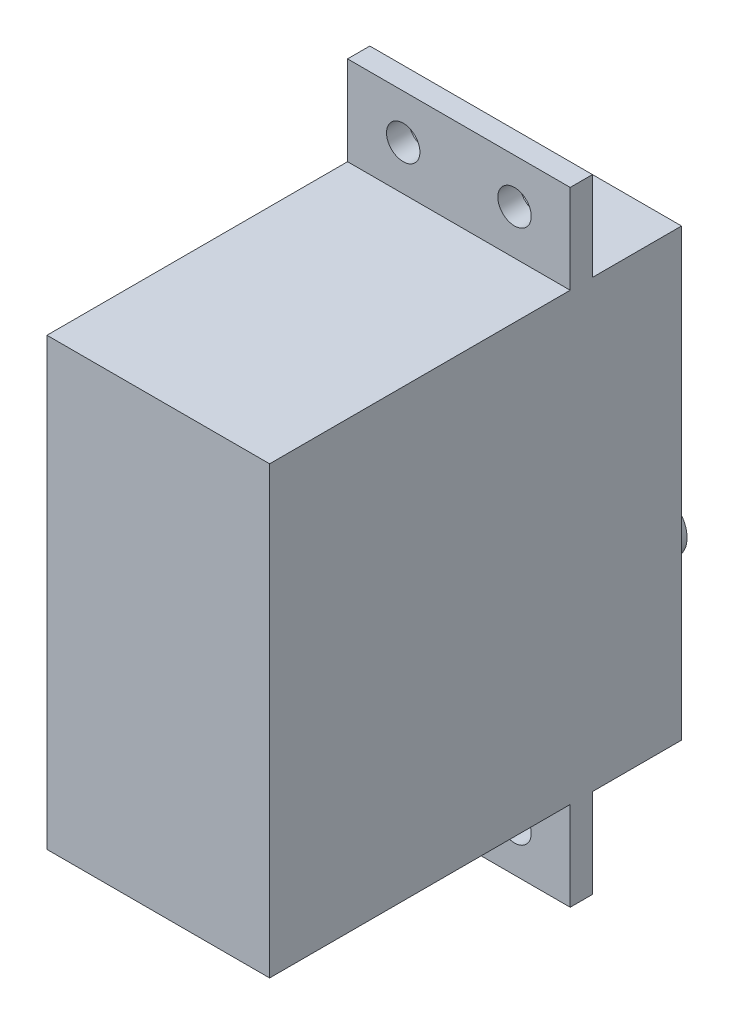
ISO-10303-21;
HEADER;
FILE_DESCRIPTION(('STEP AP214'),'2;1');
FILE_NAME('part.step','',(''),(''),'','','');
FILE_SCHEMA(('AUTOMOTIVE_DESIGN { 1 0 10303 214 1 1 1 1 }'));
ENDSEC;
DATA;
#1=APPLICATION_CONTEXT('core data for automotive mechanical design processes');
#2=APPLICATION_PROTOCOL_DEFINITION('international standard','automotive_design',2000,#1);
#3=PRODUCT_CONTEXT('',#1,'mechanical');
#4=PRODUCT('Part','Part','',(#3));
#5=PRODUCT_RELATED_PRODUCT_CATEGORY('part','',(#4));
#6=PRODUCT_DEFINITION_FORMATION('','',#4);
#7=PRODUCT_DEFINITION_CONTEXT('part definition',#1,'design');
#8=PRODUCT_DEFINITION('design','',#6,#7);
#9=PRODUCT_DEFINITION_SHAPE('','',#8);
#10=(LENGTH_UNIT() NAMED_UNIT(*) SI_UNIT(.MILLI.,.METRE.));
#11=(NAMED_UNIT(*) PLANE_ANGLE_UNIT() SI_UNIT($,.RADIAN.));
#12=(NAMED_UNIT(*) SI_UNIT($,.STERADIAN.) SOLID_ANGLE_UNIT());
#13=UNCERTAINTY_MEASURE_WITH_UNIT(LENGTH_MEASURE(1.E-05),#10,'distance_accuracy_value','');
#14=(GEOMETRIC_REPRESENTATION_CONTEXT(3) GLOBAL_UNCERTAINTY_ASSIGNED_CONTEXT((#13)) GLOBAL_UNIT_ASSIGNED_CONTEXT((#10,
#11,#12)) REPRESENTATION_CONTEXT('',''));
#15=CARTESIAN_POINT('',(0.,0.,0.));
#16=DIRECTION('',(0.,0.,1.));
#17=DIRECTION('',(1.,0.,0.));
#18=AXIS2_PLACEMENT_3D('',#15,#16,#17);
#19=CARTESIAN_POINT('',(-10.,-20.,37.));
#20=DIRECTION('',(0.,1.,0.));
#21=DIRECTION('',(0.,0.,1.));
#22=AXIS2_PLACEMENT_3D('',#19,#20,#21);
#23=PLANE('',#22);
#24=DIRECTION('',(0.,0.,-1.));
#25=VECTOR('',#24,1.);
#26=CARTESIAN_POINT('',(-10.,-20.,37.));
#27=LINE('',#26,#25);
#28=CARTESIAN_POINT('',(-10.,-20.,37.));
#29=VERTEX_POINT('',#28);
#30=CARTESIAN_POINT('',(-10.,-20.,10.));
#31=VERTEX_POINT('',#30);
#32=EDGE_CURVE('E254',#29,#31,#27,.T.);
#33=ORIENTED_EDGE('',*,*,#32,.T.);
#34=DIRECTION('',(1.,0.,0.));
#35=VECTOR('',#34,1.);
#36=CARTESIAN_POINT('',(-10.,-20.,10.));
#37=LINE('',#36,#35);
#38=CARTESIAN_POINT('',(10.,-20.,10.));
#39=VERTEX_POINT('',#38);
#40=EDGE_CURVE('E150',#31,#39,#37,.T.);
#41=ORIENTED_EDGE('',*,*,#40,.T.);
#42=DIRECTION('',(0.,0.,-1.));
#43=VECTOR('',#42,1.);
#44=CARTESIAN_POINT('',(10.,-20.,37.));
#45=LINE('',#44,#43);
#46=CARTESIAN_POINT('',(10.,-20.,37.));
#47=VERTEX_POINT('',#46);
#48=EDGE_CURVE('E250',#47,#39,#45,.T.);
#49=ORIENTED_EDGE('',*,*,#48,.F.);
#50=DIRECTION('',(1.,0.,0.));
#51=VECTOR('',#50,1.);
#52=CARTESIAN_POINT('',(-10.,-20.,37.));
#53=LINE('',#52,#51);
#54=EDGE_CURVE('E233',#29,#47,#53,.T.);
#55=ORIENTED_EDGE('',*,*,#54,.F.);
#56=EDGE_LOOP('',(#33,#41,#49,#55));
#57=FACE_BOUND('',#56,.T.);
#58=ADVANCED_FACE('F39',(#57),#23,.F.);
#59=CARTESIAN_POINT('',(-10.,20.,37.));
#60=DIRECTION('',(0.,-1.,0.));
#61=DIRECTION('',(0.,0.,-1.));
#62=AXIS2_PLACEMENT_3D('',#59,#60,#61);
#63=PLANE('',#62);
#64=DIRECTION('',(-1.,0.,0.));
#65=VECTOR('',#64,1.);
#66=CARTESIAN_POINT('',(-10.,20.,8.));
#67=LINE('',#66,#65);
#68=CARTESIAN_POINT('',(10.,20.,8.));
#69=VERTEX_POINT('',#68);
#70=CARTESIAN_POINT('',(-10.,20.,8.));
#71=VERTEX_POINT('',#70);
#72=EDGE_CURVE('E65',#69,#71,#67,.T.);
#73=ORIENTED_EDGE('',*,*,#72,.F.);
#74=DIRECTION('',(0.,0.,-1.));
#75=VECTOR('',#74,1.);
#76=CARTESIAN_POINT('',(10.,20.,37.));
#77=LINE('',#76,#75);
#78=CARTESIAN_POINT('',(10.,20.,0.));
#79=VERTEX_POINT('',#78);
#80=EDGE_CURVE('E49',#69,#79,#77,.T.);
#81=ORIENTED_EDGE('',*,*,#80,.T.);
#82=DIRECTION('',(-1.,0.,0.));
#83=VECTOR('',#82,1.);
#84=CARTESIAN_POINT('',(-10.,20.,0.));
#85=LINE('',#84,#83);
#86=CARTESIAN_POINT('',(-10.,20.,0.));
#87=VERTEX_POINT('',#86);
#88=EDGE_CURVE('E240',#79,#87,#85,.T.);
#89=ORIENTED_EDGE('',*,*,#88,.T.);
#90=DIRECTION('',(0.,0.,-1.));
#91=VECTOR('',#90,1.);
#92=CARTESIAN_POINT('',(-10.,20.,37.));
#93=LINE('',#92,#91);
#94=EDGE_CURVE('E258',#71,#87,#93,.T.);
#95=ORIENTED_EDGE('',*,*,#94,.F.);
#96=EDGE_LOOP('',(#73,#81,#89,#95));
#97=FACE_BOUND('',#96,.T.);
#98=ADVANCED_FACE('F313',(#97),#63,.F.);
#99=DIRECTION('',(1.,0.,0.));
#100=VECTOR('',#99,1.);
#101=CARTESIAN_POINT('',(-10.,20.,10.));
#102=LINE('',#101,#100);
#103=CARTESIAN_POINT('',(-10.,20.,10.));
#104=VERTEX_POINT('',#103);
#105=CARTESIAN_POINT('',(10.,20.,10.));
#106=VERTEX_POINT('',#105);
#107=EDGE_CURVE('E186',#104,#106,#102,.T.);
#108=ORIENTED_EDGE('',*,*,#107,.F.);
#109=CARTESIAN_POINT('',(-10.,20.,37.));
#110=VERTEX_POINT('',#109);
#111=EDGE_CURVE('E259',#110,#104,#93,.T.);
#112=ORIENTED_EDGE('',*,*,#111,.F.);
#113=DIRECTION('',(-1.,0.,0.));
#114=VECTOR('',#113,1.);
#115=CARTESIAN_POINT('',(-10.,20.,37.));
#116=LINE('',#115,#114);
#117=CARTESIAN_POINT('',(10.,20.,37.));
#118=VERTEX_POINT('',#117);
#119=EDGE_CURVE('E226',#118,#110,#116,.T.);
#120=ORIENTED_EDGE('',*,*,#119,.F.);
#121=EDGE_CURVE('E11',#118,#106,#77,.T.);
#122=ORIENTED_EDGE('',*,*,#121,.T.);
#123=EDGE_LOOP('',(#108,#112,#120,#122));
#124=FACE_BOUND('',#123,.T.);
#125=ADVANCED_FACE('F320',(#124),#63,.F.);
#126=CARTESIAN_POINT('',(10.,-20.,37.));
#127=DIRECTION('',(-1.,0.,0.));
#128=DIRECTION('',(0.,0.,1.));
#129=AXIS2_PLACEMENT_3D('',#126,#127,#128);
#130=PLANE('',#129);
#131=DIRECTION('',(0.,1.,0.));
#132=VECTOR('',#131,1.);
#133=CARTESIAN_POINT('',(10.,-20.,0.));
#134=LINE('',#133,#132);
#135=CARTESIAN_POINT('',(10.,-20.,0.));
#136=VERTEX_POINT('',#135);
#137=EDGE_CURVE('E221',#136,#79,#134,.T.);
#138=ORIENTED_EDGE('',*,*,#137,.T.);
#139=ORIENTED_EDGE('',*,*,#80,.F.);
#140=DIRECTION('',(0.,-1.,0.));
#141=VECTOR('',#140,1.);
#142=CARTESIAN_POINT('',(10.,28.,8.));
#143=LINE('',#142,#141);
#144=CARTESIAN_POINT('',(10.,28.,8.));
#145=VERTEX_POINT('',#144);
#146=EDGE_CURVE('E209',#145,#69,#143,.T.);
#147=ORIENTED_EDGE('',*,*,#146,.F.);
#148=DIRECTION('',(0.,0.,-1.));
#149=VECTOR('',#148,1.);
#150=CARTESIAN_POINT('',(10.,28.,10.));
#151=LINE('',#150,#149);
#152=CARTESIAN_POINT('',(10.,28.,10.));
#153=VERTEX_POINT('',#152);
#154=EDGE_CURVE('E194',#153,#145,#151,.T.);
#155=ORIENTED_EDGE('',*,*,#154,.F.);
#156=DIRECTION('',(0.,-1.,0.));
#157=VECTOR('',#156,1.);
#158=CARTESIAN_POINT('',(10.,28.,10.));
#159=LINE('',#158,#157);
#160=EDGE_CURVE('E213',#153,#106,#159,.T.);
#161=ORIENTED_EDGE('',*,*,#160,.T.);
#162=ORIENTED_EDGE('',*,*,#121,.F.);
#163=DIRECTION('',(0.,1.,0.));
#164=VECTOR('',#163,1.);
#165=CARTESIAN_POINT('',(10.,-20.,37.));
#166=LINE('',#165,#164);
#167=EDGE_CURVE('E222',#47,#118,#166,.T.);
#168=ORIENTED_EDGE('',*,*,#167,.F.);
#169=ORIENTED_EDGE('',*,*,#48,.T.);
#170=DIRECTION('',(0.,1.,0.));
#171=VECTOR('',#170,1.);
#172=CARTESIAN_POINT('',(10.,-28.,10.));
#173=LINE('',#172,#171);
#174=CARTESIAN_POINT('',(10.,-28.,10.));
#175=VERTEX_POINT('',#174);
#176=EDGE_CURVE('E172',#175,#39,#173,.T.);
#177=ORIENTED_EDGE('',*,*,#176,.F.);
#178=DIRECTION('',(0.,0.,-1.));
#179=VECTOR('',#178,1.);
#180=CARTESIAN_POINT('',(10.,-28.,10.));
#181=LINE('',#180,#179);
#182=CARTESIAN_POINT('',(10.,-28.,8.));
#183=VERTEX_POINT('',#182);
#184=EDGE_CURVE('E154',#175,#183,#181,.T.);
#185=ORIENTED_EDGE('',*,*,#184,.T.);
#186=DIRECTION('',(0.,1.,0.));
#187=VECTOR('',#186,1.);
#188=CARTESIAN_POINT('',(10.,-28.,8.));
#189=LINE('',#188,#187);
#190=CARTESIAN_POINT('',(10.,-20.,8.));
#191=VERTEX_POINT('',#190);
#192=EDGE_CURVE('E139',#183,#191,#189,.T.);
#193=ORIENTED_EDGE('',*,*,#192,.T.);
#194=EDGE_CURVE('E236',#191,#136,#45,.T.);
#195=ORIENTED_EDGE('',*,*,#194,.T.);
#196=EDGE_LOOP('',(#138,#139,#147,#155,#161,#162,#168,#169,#177,#185,#193,#195));
#197=FACE_BOUND('',#196,.T.);
#198=ADVANCED_FACE('F41',(#197),#130,.F.);
#199=CARTESIAN_POINT('',(-10.,-20.,37.));
#200=DIRECTION('',(1.,0.,0.));
#201=DIRECTION('',(0.,0.,-1.));
#202=AXIS2_PLACEMENT_3D('',#199,#200,#201);
#203=PLANE('',#202);
#204=DIRECTION('',(0.,-1.,0.));
#205=VECTOR('',#204,1.);
#206=CARTESIAN_POINT('',(-10.,-20.,0.));
#207=LINE('',#206,#205);
#208=CARTESIAN_POINT('',(-10.,-20.,0.));
#209=VERTEX_POINT('',#208);
#210=EDGE_CURVE('E244',#87,#209,#207,.T.);
#211=ORIENTED_EDGE('',*,*,#210,.T.);
#212=CARTESIAN_POINT('',(-10.,-20.,8.));
#213=VERTEX_POINT('',#212);
#214=EDGE_CURVE('E136',#213,#209,#27,.T.);
#215=ORIENTED_EDGE('',*,*,#214,.F.);
#216=DIRECTION('',(0.,1.,0.));
#217=VECTOR('',#216,1.);
#218=CARTESIAN_POINT('',(-10.,-28.,8.));
#219=LINE('',#218,#217);
#220=CARTESIAN_POINT('',(-10.,-28.,8.));
#221=VERTEX_POINT('',#220);
#222=EDGE_CURVE('E57',#221,#213,#219,.T.);
#223=ORIENTED_EDGE('',*,*,#222,.F.);
#224=DIRECTION('',(0.,0.,1.));
#225=VECTOR('',#224,1.);
#226=CARTESIAN_POINT('',(-10.,-28.,10.));
#227=LINE('',#226,#225);
#228=CARTESIAN_POINT('',(-10.,-28.,10.));
#229=VERTEX_POINT('',#228);
#230=EDGE_CURVE('E134',#221,#229,#227,.T.);
#231=ORIENTED_EDGE('',*,*,#230,.T.);
#232=DIRECTION('',(0.,1.,0.));
#233=VECTOR('',#232,1.);
#234=CARTESIAN_POINT('',(-10.,-28.,10.));
#235=LINE('',#234,#233);
#236=EDGE_CURVE('E162',#229,#31,#235,.T.);
#237=ORIENTED_EDGE('',*,*,#236,.T.);
#238=ORIENTED_EDGE('',*,*,#32,.F.);
#239=DIRECTION('',(0.,-1.,0.));
#240=VECTOR('',#239,1.);
#241=CARTESIAN_POINT('',(-10.,-20.,37.));
#242=LINE('',#241,#240);
#243=EDGE_CURVE('E230',#110,#29,#242,.T.);
#244=ORIENTED_EDGE('',*,*,#243,.F.);
#245=ORIENTED_EDGE('',*,*,#111,.T.);
#246=DIRECTION('',(0.,-1.,0.));
#247=VECTOR('',#246,1.);
#248=CARTESIAN_POINT('',(-10.,28.,10.));
#249=LINE('',#248,#247);
#250=CARTESIAN_POINT('',(-10.,28.,10.));
#251=VERTEX_POINT('',#250);
#252=EDGE_CURVE('E217',#251,#104,#249,.T.);
#253=ORIENTED_EDGE('',*,*,#252,.F.);
#254=DIRECTION('',(0.,0.,1.));
#255=VECTOR('',#254,1.);
#256=CARTESIAN_POINT('',(-10.,28.,10.));
#257=LINE('',#256,#255);
#258=CARTESIAN_POINT('',(-10.,28.,8.));
#259=VERTEX_POINT('',#258);
#260=EDGE_CURVE('E187',#259,#251,#257,.T.);
#261=ORIENTED_EDGE('',*,*,#260,.F.);
#262=DIRECTION('',(0.,-1.,0.));
#263=VECTOR('',#262,1.);
#264=CARTESIAN_POINT('',(-10.,28.,8.));
#265=LINE('',#264,#263);
#266=EDGE_CURVE('E200',#259,#71,#265,.T.);
#267=ORIENTED_EDGE('',*,*,#266,.T.);
#268=ORIENTED_EDGE('',*,*,#94,.T.);
#269=EDGE_LOOP('',(#211,#215,#223,#231,#237,#238,#244,#245,#253,#261,#267,#268));
#270=FACE_BOUND('',#269,.T.);
#271=ADVANCED_FACE('F133',(#270),#203,.F.);
#272=ORIENTED_EDGE('',*,*,#194,.F.);
#273=DIRECTION('',(-1.,0.,0.));
#274=VECTOR('',#273,1.);
#275=CARTESIAN_POINT('',(-10.,-20.,8.));
#276=LINE('',#275,#274);
#277=EDGE_CURVE('E163',#191,#213,#276,.T.);
#278=ORIENTED_EDGE('',*,*,#277,.T.);
#279=ORIENTED_EDGE('',*,*,#214,.T.);
#280=DIRECTION('',(1.,0.,0.));
#281=VECTOR('',#280,1.);
#282=CARTESIAN_POINT('',(-10.,-20.,0.));
#283=LINE('',#282,#281);
#284=EDGE_CURVE('E227',#209,#136,#283,.T.);
#285=ORIENTED_EDGE('',*,*,#284,.T.);
#286=EDGE_LOOP('',(#272,#278,#279,#285));
#287=FACE_BOUND('',#286,.T.);
#288=ADVANCED_FACE('F316',(#287),#23,.F.);
#289=CARTESIAN_POINT('',(0.,0.,37.));
#290=DIRECTION('',(0.,0.,-1.));
#291=DIRECTION('',(-1.,0.,0.));
#292=AXIS2_PLACEMENT_3D('',#289,#290,#291);
#293=PLANE('',#292);
#294=ORIENTED_EDGE('',*,*,#167,.T.);
#295=ORIENTED_EDGE('',*,*,#119,.T.);
#296=ORIENTED_EDGE('',*,*,#243,.T.);
#297=ORIENTED_EDGE('',*,*,#54,.T.);
#298=EDGE_LOOP('',(#294,#295,#296,#297));
#299=FACE_BOUND('',#298,.T.);
#300=ADVANCED_FACE('F324',(#299),#293,.F.);
#301=CARTESIAN_POINT('',(0.,0.,0.));
#302=DIRECTION('',(0.,0.,-1.));
#303=DIRECTION('',(-1.,0.,0.));
#304=AXIS2_PLACEMENT_3D('',#301,#302,#303);
#305=PLANE('',#304);
#306=CARTESIAN_POINT('',(0.,-12.,0.));
#307=DIRECTION('',(0.,0.,-1.));
#308=DIRECTION('',(-1.,0.,0.));
#309=AXIS2_PLACEMENT_3D('',#306,#307,#308);
#310=CIRCLE('',#309,2.5);
#311=CARTESIAN_POINT('',(-2.5,-12.,0.));
#312=VERTEX_POINT('',#311);
#313=EDGE_CURVE('E280',#312,#312,#310,.T.);
#314=ORIENTED_EDGE('',*,*,#313,.F.);
#315=EDGE_LOOP('',(#314));
#316=FACE_BOUND('',#315,.T.);
#317=ORIENTED_EDGE('',*,*,#137,.F.);
#318=ORIENTED_EDGE('',*,*,#284,.F.);
#319=ORIENTED_EDGE('',*,*,#210,.F.);
#320=ORIENTED_EDGE('',*,*,#88,.F.);
#321=EDGE_LOOP('',(#317,#318,#319,#320));
#322=FACE_BOUND('',#321,.T.);
#323=ADVANCED_FACE('F330',(#316,#322),#305,.T.);
#324=CARTESIAN_POINT('',(-10.,28.,10.));
#325=DIRECTION('',(0.,0.,-1.));
#326=DIRECTION('',(-1.,0.,0.));
#327=AXIS2_PLACEMENT_3D('',#324,#325,#326);
#328=PLANE('',#327);
#329=CARTESIAN_POINT('',(5.,24.,10.));
#330=DIRECTION('',(0.,0.,-1.));
#331=DIRECTION('',(-1.,0.,0.));
#332=AXIS2_PLACEMENT_3D('',#329,#330,#331);
#333=CIRCLE('',#332,1.5);
#334=CARTESIAN_POINT('',(6.5,24.,10.));
#335=VERTEX_POINT('',#334);
#336=EDGE_CURVE('E182',#335,#335,#333,.T.);
#337=ORIENTED_EDGE('',*,*,#336,.T.);
#338=EDGE_LOOP('',(#337));
#339=FACE_BOUND('',#338,.T.);
#340=CARTESIAN_POINT('',(-5.,24.,10.));
#341=DIRECTION('',(0.,0.,-1.));
#342=DIRECTION('',(-1.,0.,0.));
#343=AXIS2_PLACEMENT_3D('',#340,#341,#342);
#344=CIRCLE('',#343,1.5);
#345=CARTESIAN_POINT('',(-3.5,24.,10.));
#346=VERTEX_POINT('',#345);
#347=EDGE_CURVE('E177',#346,#346,#344,.T.);
#348=ORIENTED_EDGE('',*,*,#347,.T.);
#349=EDGE_LOOP('',(#348));
#350=FACE_BOUND('',#349,.T.);
#351=ORIENTED_EDGE('',*,*,#107,.T.);
#352=ORIENTED_EDGE('',*,*,#160,.F.);
#353=DIRECTION('',(1.,0.,0.));
#354=VECTOR('',#353,1.);
#355=CARTESIAN_POINT('',(-10.,28.,10.));
#356=LINE('',#355,#354);
#357=EDGE_CURVE('E191',#251,#153,#356,.T.);
#358=ORIENTED_EDGE('',*,*,#357,.F.);
#359=ORIENTED_EDGE('',*,*,#252,.T.);
#360=EDGE_LOOP('',(#351,#352,#358,#359));
#361=FACE_BOUND('',#360,.T.);
#362=ADVANCED_FACE('F360',(#339,#350,#361),#328,.F.);
#363=CARTESIAN_POINT('',(-10.,28.,8.));
#364=DIRECTION('',(0.,0.,1.));
#365=DIRECTION('',(1.,0.,0.));
#366=AXIS2_PLACEMENT_3D('',#363,#364,#365);
#367=PLANE('',#366);
#368=CARTESIAN_POINT('',(5.,24.,8.));
#369=DIRECTION('',(0.,0.,1.));
#370=DIRECTION('',(1.,0.,0.));
#371=AXIS2_PLACEMENT_3D('',#368,#369,#370);
#372=CIRCLE('',#371,1.5);
#373=CARTESIAN_POINT('',(6.5,24.,8.));
#374=VERTEX_POINT('',#373);
#375=EDGE_CURVE('E181',#374,#374,#372,.T.);
#376=ORIENTED_EDGE('',*,*,#375,.T.);
#377=EDGE_LOOP('',(#376));
#378=FACE_BOUND('',#377,.T.);
#379=CARTESIAN_POINT('',(-5.,24.,8.));
#380=DIRECTION('',(0.,0.,1.));
#381=DIRECTION('',(1.,0.,0.));
#382=AXIS2_PLACEMENT_3D('',#379,#380,#381);
#383=CIRCLE('',#382,1.5);
#384=CARTESIAN_POINT('',(-3.5,24.,8.));
#385=VERTEX_POINT('',#384);
#386=EDGE_CURVE('E138',#385,#385,#383,.T.);
#387=ORIENTED_EDGE('',*,*,#386,.T.);
#388=EDGE_LOOP('',(#387));
#389=FACE_BOUND('',#388,.T.);
#390=ORIENTED_EDGE('',*,*,#72,.T.);
#391=ORIENTED_EDGE('',*,*,#266,.F.);
#392=DIRECTION('',(-1.,0.,0.));
#393=VECTOR('',#392,1.);
#394=CARTESIAN_POINT('',(-10.,28.,8.));
#395=LINE('',#394,#393);
#396=EDGE_CURVE('E197',#145,#259,#395,.T.);
#397=ORIENTED_EDGE('',*,*,#396,.F.);
#398=ORIENTED_EDGE('',*,*,#146,.T.);
#399=EDGE_LOOP('',(#390,#391,#397,#398));
#400=FACE_BOUND('',#399,.T.);
#401=ADVANCED_FACE('F367',(#378,#389,#400),#367,.F.);
#402=CARTESIAN_POINT('',(0.,28.,0.));
#403=DIRECTION('',(0.,-1.,0.));
#404=DIRECTION('',(0.,0.,-1.));
#405=AXIS2_PLACEMENT_3D('',#402,#403,#404);
#406=PLANE('',#405);
#407=ORIENTED_EDGE('',*,*,#260,.T.);
#408=ORIENTED_EDGE('',*,*,#357,.T.);
#409=ORIENTED_EDGE('',*,*,#154,.T.);
#410=ORIENTED_EDGE('',*,*,#396,.T.);
#411=EDGE_LOOP('',(#407,#408,#409,#410));
#412=FACE_BOUND('',#411,.T.);
#413=ADVANCED_FACE('F363',(#412),#406,.F.);
#414=CARTESIAN_POINT('',(-5.,24.,-1.2E-05));
#415=DIRECTION('',(0.,0.,1.));
#416=DIRECTION('',(1.,0.,0.));
#417=AXIS2_PLACEMENT_3D('',#414,#415,#416);
#418=CYLINDRICAL_SURFACE('',#417,1.5);
#419=CARTESIAN_POINT('',(-3.5,24.,8.));
#420=CARTESIAN_POINT('',(-3.5,24.,8.02083333333333));
#421=CARTESIAN_POINT('',(-3.5,24.,8.04166666666667));
#422=CARTESIAN_POINT('',(-3.5,24.,8.08333333333333));
#423=CARTESIAN_POINT('',(-3.5,24.,8.10416666666667));
#424=CARTESIAN_POINT('',(-3.5,24.,8.14583333333333));
#425=CARTESIAN_POINT('',(-3.5,24.,8.16666666666667));
#426=CARTESIAN_POINT('',(-3.5,24.,8.20833333333333));
#427=CARTESIAN_POINT('',(-3.5,24.,8.22916666666667));
#428=CARTESIAN_POINT('',(-3.5,24.,8.27083333333333));
#429=CARTESIAN_POINT('',(-3.5,24.,8.29166666666667));
#430=CARTESIAN_POINT('',(-3.5,24.,8.33333333333333));
#431=CARTESIAN_POINT('',(-3.5,24.,8.35416666666667));
#432=CARTESIAN_POINT('',(-3.5,24.,8.39583333333333));
#433=CARTESIAN_POINT('',(-3.5,24.,8.41666666666667));
#434=CARTESIAN_POINT('',(-3.5,24.,8.45833333333333));
#435=CARTESIAN_POINT('',(-3.5,24.,8.47916666666667));
#436=CARTESIAN_POINT('',(-3.5,24.,8.52083333333333));
#437=CARTESIAN_POINT('',(-3.5,24.,8.54166666666667));
#438=CARTESIAN_POINT('',(-3.5,24.,8.58333333333333));
#439=CARTESIAN_POINT('',(-3.5,24.,8.60416666666667));
#440=CARTESIAN_POINT('',(-3.5,24.,8.64583333333333));
#441=CARTESIAN_POINT('',(-3.5,24.,8.66666666666667));
#442=CARTESIAN_POINT('',(-3.5,24.,8.70833333333333));
#443=CARTESIAN_POINT('',(-3.5,24.,8.72916666666667));
#444=CARTESIAN_POINT('',(-3.5,24.,8.77083333333333));
#445=CARTESIAN_POINT('',(-3.5,24.,8.79166666666667));
#446=CARTESIAN_POINT('',(-3.5,24.,8.83333333333333));
#447=CARTESIAN_POINT('',(-3.5,24.,8.85416666666667));
#448=CARTESIAN_POINT('',(-3.5,24.,8.89583333333333));
#449=CARTESIAN_POINT('',(-3.5,24.,8.91666666666667));
#450=CARTESIAN_POINT('',(-3.5,24.,8.95833333333333));
#451=CARTESIAN_POINT('',(-3.5,24.,8.97916666666667));
#452=CARTESIAN_POINT('',(-3.5,24.,9.02083333333333));
#453=CARTESIAN_POINT('',(-3.5,24.,9.04166666666667));
#454=CARTESIAN_POINT('',(-3.5,24.,9.08333333333333));
#455=CARTESIAN_POINT('',(-3.5,24.,9.10416666666667));
#456=CARTESIAN_POINT('',(-3.5,24.,9.14583333333333));
#457=CARTESIAN_POINT('',(-3.5,24.,9.16666666666667));
#458=CARTESIAN_POINT('',(-3.5,24.,9.20833333333333));
#459=CARTESIAN_POINT('',(-3.5,24.,9.22916666666667));
#460=CARTESIAN_POINT('',(-3.5,24.,9.27083333333333));
#461=CARTESIAN_POINT('',(-3.5,24.,9.29166666666667));
#462=CARTESIAN_POINT('',(-3.5,24.,9.33333333333333));
#463=CARTESIAN_POINT('',(-3.5,24.,9.35416666666667));
#464=CARTESIAN_POINT('',(-3.5,24.,9.39583333333334));
#465=CARTESIAN_POINT('',(-3.5,24.,9.41666666666667));
#466=CARTESIAN_POINT('',(-3.5,24.,9.45833333333334));
#467=CARTESIAN_POINT('',(-3.5,24.,9.47916666666667));
#468=CARTESIAN_POINT('',(-3.5,24.,9.52083333333334));
#469=CARTESIAN_POINT('',(-3.5,24.,9.54166666666667));
#470=CARTESIAN_POINT('',(-3.5,24.,9.58333333333334));
#471=CARTESIAN_POINT('',(-3.5,24.,9.60416666666667));
#472=CARTESIAN_POINT('',(-3.5,24.,9.64583333333334));
#473=CARTESIAN_POINT('',(-3.5,24.,9.66666666666667));
#474=CARTESIAN_POINT('',(-3.5,24.,9.70833333333334));
#475=CARTESIAN_POINT('',(-3.5,24.,9.72916666666667));
#476=CARTESIAN_POINT('',(-3.5,24.,9.77083333333334));
#477=CARTESIAN_POINT('',(-3.5,24.,9.79166666666667));
#478=CARTESIAN_POINT('',(-3.5,24.,9.83333333333334));
#479=CARTESIAN_POINT('',(-3.5,24.,9.85416666666667));
#480=CARTESIAN_POINT('',(-3.5,24.,9.89583333333334));
#481=CARTESIAN_POINT('',(-3.5,24.,9.91666666666667));
#482=CARTESIAN_POINT('',(-3.5,24.,9.95833333333334));
#483=CARTESIAN_POINT('',(-3.5,24.,9.97916666666667));
#484=CARTESIAN_POINT('',(-3.5,24.,10.));
#485=B_SPLINE_CURVE_WITH_KNOTS('',3,(#419,#420,#421,#422,#423,#424,#425,#426,#427,#428,#429,
#430,#431,#432,#433,#434,#435,#436,#437,#438,#439,#440,#441,#442,#443,#444,#445,#446,#447,#448,
#449,#450,#451,#452,#453,#454,#455,#456,#457,#458,#459,#460,#461,#462,#463,#464,#465,#466,#467,
#468,#469,#470,#471,#472,#473,#474,#475,#476,#477,#478,#479,#480,#481,#482,#483,#484),
.UNSPECIFIED.,.F.,.F.,(4,2,2,2,2,2,2,2,2,2,2,2,2,2,2,2,2,2,2,2,2,2,2,2,2,2,2,2,2,2,2,2,4),(0.,
0.0625000000000001,0.125,0.1875,0.25,0.3125,0.375,0.4375,0.5,0.562500000000002,
0.625000000000002,0.687500000000002,0.750000000000002,0.812500000000002,0.875000000000003,
0.937500000000003,1.,1.0625,1.125,1.1875,1.25,1.3125,1.375,1.4375,1.5,1.5625,1.625,1.6875,
1.75000000000001,1.81250000000001,1.87500000000001,1.93750000000001,2.00000000000001),.UNSPECIFIED.);
#486=EDGE_CURVE('BSEAM385',#385,#346,#485,.T.);
#487=ORIENTED_EDGE('',*,*,#386,.F.);
#488=ORIENTED_EDGE('',*,*,#347,.F.);
#489=ORIENTED_EDGE('',*,*,#486,.T.);
#490=ORIENTED_EDGE('',*,*,#486,.F.);
#491=EDGE_LOOP('',(#487,#489,#488,#490));
#492=FACE_BOUND('',#491,.T.);
#493=ADVANCED_FACE('F385',(#492),#418,.F.);
#494=CARTESIAN_POINT('',(5.,24.,-1.2E-05));
#495=DIRECTION('',(0.,0.,1.));
#496=DIRECTION('',(1.,0.,0.));
#497=AXIS2_PLACEMENT_3D('',#494,#495,#496);
#498=CYLINDRICAL_SURFACE('',#497,1.5);
#499=CARTESIAN_POINT('',(6.5,24.,8.));
#500=CARTESIAN_POINT('',(6.5,24.,8.02083333333333));
#501=CARTESIAN_POINT('',(6.5,24.,8.04166666666667));
#502=CARTESIAN_POINT('',(6.5,24.,8.08333333333333));
#503=CARTESIAN_POINT('',(6.5,24.,8.10416666666667));
#504=CARTESIAN_POINT('',(6.5,24.,8.14583333333333));
#505=CARTESIAN_POINT('',(6.5,24.,8.16666666666667));
#506=CARTESIAN_POINT('',(6.5,24.,8.20833333333333));
#507=CARTESIAN_POINT('',(6.5,24.,8.22916666666667));
#508=CARTESIAN_POINT('',(6.5,24.,8.27083333333333));
#509=CARTESIAN_POINT('',(6.5,24.,8.29166666666667));
#510=CARTESIAN_POINT('',(6.5,24.,8.33333333333333));
#511=CARTESIAN_POINT('',(6.5,24.,8.35416666666667));
#512=CARTESIAN_POINT('',(6.5,24.,8.39583333333333));
#513=CARTESIAN_POINT('',(6.5,24.,8.41666666666667));
#514=CARTESIAN_POINT('',(6.5,24.,8.45833333333333));
#515=CARTESIAN_POINT('',(6.5,24.,8.47916666666667));
#516=CARTESIAN_POINT('',(6.5,24.,8.52083333333333));
#517=CARTESIAN_POINT('',(6.5,24.,8.54166666666667));
#518=CARTESIAN_POINT('',(6.5,24.,8.58333333333333));
#519=CARTESIAN_POINT('',(6.5,24.,8.60416666666667));
#520=CARTESIAN_POINT('',(6.5,24.,8.64583333333333));
#521=CARTESIAN_POINT('',(6.5,24.,8.66666666666667));
#522=CARTESIAN_POINT('',(6.5,24.,8.70833333333333));
#523=CARTESIAN_POINT('',(6.5,24.,8.72916666666667));
#524=CARTESIAN_POINT('',(6.5,24.,8.77083333333333));
#525=CARTESIAN_POINT('',(6.5,24.,8.79166666666667));
#526=CARTESIAN_POINT('',(6.5,24.,8.83333333333333));
#527=CARTESIAN_POINT('',(6.5,24.,8.85416666666667));
#528=CARTESIAN_POINT('',(6.5,24.,8.89583333333333));
#529=CARTESIAN_POINT('',(6.5,24.,8.91666666666667));
#530=CARTESIAN_POINT('',(6.5,24.,8.95833333333333));
#531=CARTESIAN_POINT('',(6.5,24.,8.97916666666667));
#532=CARTESIAN_POINT('',(6.5,24.,9.02083333333333));
#533=CARTESIAN_POINT('',(6.5,24.,9.04166666666667));
#534=CARTESIAN_POINT('',(6.5,24.,9.08333333333333));
#535=CARTESIAN_POINT('',(6.5,24.,9.10416666666667));
#536=CARTESIAN_POINT('',(6.5,24.,9.14583333333333));
#537=CARTESIAN_POINT('',(6.5,24.,9.16666666666667));
#538=CARTESIAN_POINT('',(6.5,24.,9.20833333333333));
#539=CARTESIAN_POINT('',(6.5,24.,9.22916666666667));
#540=CARTESIAN_POINT('',(6.5,24.,9.27083333333333));
#541=CARTESIAN_POINT('',(6.5,24.,9.29166666666667));
#542=CARTESIAN_POINT('',(6.5,24.,9.33333333333333));
#543=CARTESIAN_POINT('',(6.5,24.,9.35416666666667));
#544=CARTESIAN_POINT('',(6.5,24.,9.39583333333334));
#545=CARTESIAN_POINT('',(6.5,24.,9.41666666666667));
#546=CARTESIAN_POINT('',(6.5,24.,9.45833333333334));
#547=CARTESIAN_POINT('',(6.5,24.,9.47916666666667));
#548=CARTESIAN_POINT('',(6.5,24.,9.52083333333334));
#549=CARTESIAN_POINT('',(6.5,24.,9.54166666666667));
#550=CARTESIAN_POINT('',(6.5,24.,9.58333333333334));
#551=CARTESIAN_POINT('',(6.5,24.,9.60416666666667));
#552=CARTESIAN_POINT('',(6.5,24.,9.64583333333334));
#553=CARTESIAN_POINT('',(6.5,24.,9.66666666666667));
#554=CARTESIAN_POINT('',(6.5,24.,9.70833333333334));
#555=CARTESIAN_POINT('',(6.5,24.,9.72916666666667));
#556=CARTESIAN_POINT('',(6.5,24.,9.77083333333334));
#557=CARTESIAN_POINT('',(6.5,24.,9.79166666666667));
#558=CARTESIAN_POINT('',(6.5,24.,9.83333333333334));
#559=CARTESIAN_POINT('',(6.5,24.,9.85416666666667));
#560=CARTESIAN_POINT('',(6.5,24.,9.89583333333334));
#561=CARTESIAN_POINT('',(6.5,24.,9.91666666666667));
#562=CARTESIAN_POINT('',(6.5,24.,9.95833333333334));
#563=CARTESIAN_POINT('',(6.5,24.,9.97916666666667));
#564=CARTESIAN_POINT('',(6.5,24.,10.));
#565=B_SPLINE_CURVE_WITH_KNOTS('',3,(#499,#500,#501,#502,#503,#504,#505,#506,#507,#508,#509,
#510,#511,#512,#513,#514,#515,#516,#517,#518,#519,#520,#521,#522,#523,#524,#525,#526,#527,#528,
#529,#530,#531,#532,#533,#534,#535,#536,#537,#538,#539,#540,#541,#542,#543,#544,#545,#546,#547,
#548,#549,#550,#551,#552,#553,#554,#555,#556,#557,#558,#559,#560,#561,#562,#563,#564),
.UNSPECIFIED.,.F.,.F.,(4,2,2,2,2,2,2,2,2,2,2,2,2,2,2,2,2,2,2,2,2,2,2,2,2,2,2,2,2,2,2,2,4),(0.,
0.0625000000000001,0.125,0.1875,0.25,0.3125,0.375,0.4375,0.5,0.562500000000002,
0.625000000000002,0.687500000000002,0.750000000000002,0.812500000000002,0.875000000000003,
0.937500000000003,1.,1.0625,1.125,1.1875,1.25,1.3125,1.375,1.4375,1.5,1.5625,1.625,1.6875,
1.75000000000001,1.81250000000001,1.87500000000001,1.93750000000001,2.00000000000001),.UNSPECIFIED.);
#566=EDGE_CURVE('BSEAM380',#374,#335,#565,.T.);
#567=ORIENTED_EDGE('',*,*,#375,.F.);
#568=ORIENTED_EDGE('',*,*,#336,.F.);
#569=ORIENTED_EDGE('',*,*,#566,.T.);
#570=ORIENTED_EDGE('',*,*,#566,.F.);
#571=EDGE_LOOP('',(#567,#569,#568,#570));
#572=FACE_BOUND('',#571,.T.);
#573=ADVANCED_FACE('F380',(#572),#498,.F.);
#574=CARTESIAN_POINT('',(-10.,-28.,8.));
#575=DIRECTION('',(0.,0.,-1.));
#576=DIRECTION('',(-1.,0.,0.));
#577=AXIS2_PLACEMENT_3D('',#574,#575,#576);
#578=PLANE('',#577);
#579=CARTESIAN_POINT('',(5.,-24.,8.));
#580=DIRECTION('',(0.,0.,-1.));
#581=DIRECTION('',(-1.,0.,0.));
#582=AXIS2_PLACEMENT_3D('',#579,#580,#581);
#583=CIRCLE('',#582,1.5);
#584=CARTESIAN_POINT('',(6.5,-24.,8.));
#585=VERTEX_POINT('',#584);
#586=EDGE_CURVE('E166',#585,#585,#583,.F.);
#587=ORIENTED_EDGE('',*,*,#586,.T.);
#588=EDGE_LOOP('',(#587));
#589=FACE_BOUND('',#588,.T.);
#590=CARTESIAN_POINT('',(-5.,-24.,8.));
#591=DIRECTION('',(0.,0.,-1.));
#592=DIRECTION('',(-1.,0.,0.));
#593=AXIS2_PLACEMENT_3D('',#590,#591,#592);
#594=CIRCLE('',#593,1.5);
#595=CARTESIAN_POINT('',(-3.5,-24.,8.));
#596=VERTEX_POINT('',#595);
#597=EDGE_CURVE('E271',#596,#596,#594,.F.);
#598=ORIENTED_EDGE('',*,*,#597,.T.);
#599=EDGE_LOOP('',(#598));
#600=FACE_BOUND('',#599,.T.);
#601=ORIENTED_EDGE('',*,*,#277,.F.);
#602=ORIENTED_EDGE('',*,*,#192,.F.);
#603=DIRECTION('',(-1.,0.,0.));
#604=VECTOR('',#603,1.);
#605=CARTESIAN_POINT('',(-10.,-28.,8.));
#606=LINE('',#605,#604);
#607=EDGE_CURVE('E145',#183,#221,#606,.T.);
#608=ORIENTED_EDGE('',*,*,#607,.T.);
#609=ORIENTED_EDGE('',*,*,#222,.T.);
#610=EDGE_LOOP('',(#601,#602,#608,#609));
#611=FACE_BOUND('',#610,.T.);
#612=ADVANCED_FACE('F152',(#589,#600,#611),#578,.T.);
#613=CARTESIAN_POINT('',(-10.,-28.,10.));
#614=DIRECTION('',(0.,0.,1.));
#615=DIRECTION('',(1.,0.,0.));
#616=AXIS2_PLACEMENT_3D('',#613,#614,#615);
#617=PLANE('',#616);
#618=CARTESIAN_POINT('',(5.,-24.,10.));
#619=DIRECTION('',(0.,0.,1.));
#620=DIRECTION('',(1.,0.,0.));
#621=AXIS2_PLACEMENT_3D('',#618,#619,#620);
#622=CIRCLE('',#621,1.5);
#623=CARTESIAN_POINT('',(6.5,-24.,10.));
#624=VERTEX_POINT('',#623);
#625=EDGE_CURVE('E43',#624,#624,#622,.F.);
#626=ORIENTED_EDGE('',*,*,#625,.T.);
#627=EDGE_LOOP('',(#626));
#628=FACE_BOUND('',#627,.T.);
#629=CARTESIAN_POINT('',(-5.,-24.,10.));
#630=DIRECTION('',(0.,0.,1.));
#631=DIRECTION('',(1.,0.,0.));
#632=AXIS2_PLACEMENT_3D('',#629,#630,#631);
#633=CIRCLE('',#632,1.5);
#634=CARTESIAN_POINT('',(-3.5,-24.,10.));
#635=VERTEX_POINT('',#634);
#636=EDGE_CURVE('E268',#635,#635,#633,.F.);
#637=ORIENTED_EDGE('',*,*,#636,.T.);
#638=EDGE_LOOP('',(#637));
#639=FACE_BOUND('',#638,.T.);
#640=ORIENTED_EDGE('',*,*,#40,.F.);
#641=ORIENTED_EDGE('',*,*,#236,.F.);
#642=DIRECTION('',(1.,0.,0.));
#643=VECTOR('',#642,1.);
#644=CARTESIAN_POINT('',(-10.,-28.,10.));
#645=LINE('',#644,#643);
#646=EDGE_CURVE('E148',#229,#175,#645,.T.);
#647=ORIENTED_EDGE('',*,*,#646,.T.);
#648=ORIENTED_EDGE('',*,*,#176,.T.);
#649=EDGE_LOOP('',(#640,#641,#647,#648));
#650=FACE_BOUND('',#649,.T.);
#651=ADVANCED_FACE('F295',(#628,#639,#650),#617,.T.);
#652=CARTESIAN_POINT('',(0.,-28.,0.));
#653=DIRECTION('',(0.,1.,0.));
#654=DIRECTION('',(0.,0.,-1.));
#655=AXIS2_PLACEMENT_3D('',#652,#653,#654);
#656=PLANE('',#655);
#657=ORIENTED_EDGE('',*,*,#230,.F.);
#658=ORIENTED_EDGE('',*,*,#607,.F.);
#659=ORIENTED_EDGE('',*,*,#184,.F.);
#660=ORIENTED_EDGE('',*,*,#646,.F.);
#661=EDGE_LOOP('',(#657,#658,#659,#660));
#662=FACE_BOUND('',#661,.T.);
#663=ADVANCED_FACE('F143',(#662),#656,.F.);
#664=CARTESIAN_POINT('',(-5.,-24.,-1.2E-05));
#665=DIRECTION('',(0.,0.,1.));
#666=DIRECTION('',(1.,0.,0.));
#667=AXIS2_PLACEMENT_3D('',#664,#665,#666);
#668=CYLINDRICAL_SURFACE('',#667,1.5);
#669=CARTESIAN_POINT('',(-3.5,-24.,8.));
#670=CARTESIAN_POINT('',(-3.5,-24.,8.02083333333333));
#671=CARTESIAN_POINT('',(-3.5,-24.,8.04166666666667));
#672=CARTESIAN_POINT('',(-3.5,-24.,8.08333333333333));
#673=CARTESIAN_POINT('',(-3.5,-24.,8.10416666666667));
#674=CARTESIAN_POINT('',(-3.5,-24.,8.14583333333333));
#675=CARTESIAN_POINT('',(-3.5,-24.,8.16666666666667));
#676=CARTESIAN_POINT('',(-3.5,-24.,8.20833333333334));
#677=CARTESIAN_POINT('',(-3.5,-24.,8.22916666666667));
#678=CARTESIAN_POINT('',(-3.5,-24.,8.27083333333334));
#679=CARTESIAN_POINT('',(-3.5,-24.,8.29166666666667));
#680=CARTESIAN_POINT('',(-3.5,-24.,8.33333333333334));
#681=CARTESIAN_POINT('',(-3.5,-24.,8.35416666666667));
#682=CARTESIAN_POINT('',(-3.5,-24.,8.39583333333334));
#683=CARTESIAN_POINT('',(-3.5,-24.,8.41666666666667));
#684=CARTESIAN_POINT('',(-3.5,-24.,8.45833333333334));
#685=CARTESIAN_POINT('',(-3.5,-24.,8.47916666666667));
#686=CARTESIAN_POINT('',(-3.5,-24.,8.52083333333334));
#687=CARTESIAN_POINT('',(-3.5,-24.,8.54166666666667));
#688=CARTESIAN_POINT('',(-3.5,-24.,8.58333333333333));
#689=CARTESIAN_POINT('',(-3.5,-24.,8.60416666666667));
#690=CARTESIAN_POINT('',(-3.5,-24.,8.64583333333333));
#691=CARTESIAN_POINT('',(-3.5,-24.,8.66666666666667));
#692=CARTESIAN_POINT('',(-3.5,-24.,8.70833333333333));
#693=CARTESIAN_POINT('',(-3.5,-24.,8.72916666666667));
#694=CARTESIAN_POINT('',(-3.5,-24.,8.77083333333333));
#695=CARTESIAN_POINT('',(-3.5,-24.,8.79166666666667));
#696=CARTESIAN_POINT('',(-3.5,-24.,8.83333333333333));
#697=CARTESIAN_POINT('',(-3.5,-24.,8.85416666666667));
#698=CARTESIAN_POINT('',(-3.5,-24.,8.89583333333333));
#699=CARTESIAN_POINT('',(-3.5,-24.,8.91666666666667));
#700=CARTESIAN_POINT('',(-3.5,-24.,8.95833333333333));
#701=CARTESIAN_POINT('',(-3.5,-24.,8.97916666666667));
#702=CARTESIAN_POINT('',(-3.5,-24.,9.02083333333333));
#703=CARTESIAN_POINT('',(-3.5,-24.,9.04166666666667));
#704=CARTESIAN_POINT('',(-3.5,-24.,9.08333333333333));
#705=CARTESIAN_POINT('',(-3.5,-24.,9.10416666666667));
#706=CARTESIAN_POINT('',(-3.5,-24.,9.14583333333333));
#707=CARTESIAN_POINT('',(-3.5,-24.,9.16666666666667));
#708=CARTESIAN_POINT('',(-3.5,-24.,9.20833333333333));
#709=CARTESIAN_POINT('',(-3.5,-24.,9.22916666666667));
#710=CARTESIAN_POINT('',(-3.5,-24.,9.27083333333333));
#711=CARTESIAN_POINT('',(-3.5,-24.,9.29166666666667));
#712=CARTESIAN_POINT('',(-3.5,-24.,9.33333333333333));
#713=CARTESIAN_POINT('',(-3.5,-24.,9.35416666666667));
#714=CARTESIAN_POINT('',(-3.5,-24.,9.39583333333333));
#715=CARTESIAN_POINT('',(-3.5,-24.,9.41666666666667));
#716=CARTESIAN_POINT('',(-3.5,-24.,9.45833333333333));
#717=CARTESIAN_POINT('',(-3.5,-24.,9.47916666666667));
#718=CARTESIAN_POINT('',(-3.5,-24.,9.52083333333333));
#719=CARTESIAN_POINT('',(-3.5,-24.,9.54166666666667));
#720=CARTESIAN_POINT('',(-3.5,-24.,9.58333333333333));
#721=CARTESIAN_POINT('',(-3.5,-24.,9.60416666666667));
#722=CARTESIAN_POINT('',(-3.5,-24.,9.64583333333333));
#723=CARTESIAN_POINT('',(-3.5,-24.,9.66666666666667));
#724=CARTESIAN_POINT('',(-3.5,-24.,9.70833333333333));
#725=CARTESIAN_POINT('',(-3.5,-24.,9.72916666666667));
#726=CARTESIAN_POINT('',(-3.5,-24.,9.77083333333333));
#727=CARTESIAN_POINT('',(-3.5,-24.,9.79166666666667));
#728=CARTESIAN_POINT('',(-3.5,-24.,9.83333333333333));
#729=CARTESIAN_POINT('',(-3.5,-24.,9.85416666666667));
#730=CARTESIAN_POINT('',(-3.5,-24.,9.89583333333333));
#731=CARTESIAN_POINT('',(-3.5,-24.,9.91666666666667));
#732=CARTESIAN_POINT('',(-3.5,-24.,9.95833333333333));
#733=CARTESIAN_POINT('',(-3.5,-24.,9.97916666666667));
#734=CARTESIAN_POINT('',(-3.5,-24.,10.));
#735=B_SPLINE_CURVE_WITH_KNOTS('',3,(#669,#670,#671,#672,#673,#674,#675,#676,#677,#678,#679,
#680,#681,#682,#683,#684,#685,#686,#687,#688,#689,#690,#691,#692,#693,#694,#695,#696,#697,#698,
#699,#700,#701,#702,#703,#704,#705,#706,#707,#708,#709,#710,#711,#712,#713,#714,#715,#716,#717,
#718,#719,#720,#721,#722,#723,#724,#725,#726,#727,#728,#729,#730,#731,#732,#733,#734),
.UNSPECIFIED.,.F.,.F.,(4,2,2,2,2,2,2,2,2,2,2,2,2,2,2,2,2,2,2,2,2,2,2,2,2,2,2,2,2,2,2,2,4),(0.,
0.0625000000000001,0.125,0.1875,0.25,0.3125,0.375,0.4375,0.5,0.562499999999999,
0.624999999999999,0.687499999999999,0.749999999999999,0.812499999999999,0.874999999999999,
0.937499999999999,0.999999999999999,1.0625,1.125,1.1875,1.25,1.3125,1.375,1.4375,1.5,1.5625,
1.625,1.6875,1.75,1.8125,1.875,1.9375,2.),.UNSPECIFIED.);
#736=EDGE_CURVE('BSEAM300',#596,#635,#735,.T.);
#737=ORIENTED_EDGE('',*,*,#597,.F.);
#738=ORIENTED_EDGE('',*,*,#636,.F.);
#739=ORIENTED_EDGE('',*,*,#736,.T.);
#740=ORIENTED_EDGE('',*,*,#736,.F.);
#741=EDGE_LOOP('',(#737,#739,#738,#740));
#742=FACE_BOUND('',#741,.T.);
#743=ADVANCED_FACE('F300',(#742),#668,.F.);
#744=CARTESIAN_POINT('',(5.,-24.,-1.2E-05));
#745=DIRECTION('',(0.,0.,1.));
#746=DIRECTION('',(1.,0.,0.));
#747=AXIS2_PLACEMENT_3D('',#744,#745,#746);
#748=CYLINDRICAL_SURFACE('',#747,1.5);
#749=CARTESIAN_POINT('',(6.5,-24.,8.));
#750=CARTESIAN_POINT('',(6.5,-24.,8.02083333333333));
#751=CARTESIAN_POINT('',(6.5,-24.,8.04166666666667));
#752=CARTESIAN_POINT('',(6.5,-24.,8.08333333333333));
#753=CARTESIAN_POINT('',(6.5,-24.,8.10416666666667));
#754=CARTESIAN_POINT('',(6.5,-24.,8.14583333333333));
#755=CARTESIAN_POINT('',(6.5,-24.,8.16666666666667));
#756=CARTESIAN_POINT('',(6.5,-24.,8.20833333333334));
#757=CARTESIAN_POINT('',(6.5,-24.,8.22916666666667));
#758=CARTESIAN_POINT('',(6.5,-24.,8.27083333333334));
#759=CARTESIAN_POINT('',(6.5,-24.,8.29166666666667));
#760=CARTESIAN_POINT('',(6.5,-24.,8.33333333333334));
#761=CARTESIAN_POINT('',(6.5,-24.,8.35416666666667));
#762=CARTESIAN_POINT('',(6.5,-24.,8.39583333333334));
#763=CARTESIAN_POINT('',(6.5,-24.,8.41666666666667));
#764=CARTESIAN_POINT('',(6.5,-24.,8.45833333333334));
#765=CARTESIAN_POINT('',(6.5,-24.,8.47916666666667));
#766=CARTESIAN_POINT('',(6.5,-24.,8.52083333333334));
#767=CARTESIAN_POINT('',(6.5,-24.,8.54166666666667));
#768=CARTESIAN_POINT('',(6.5,-24.,8.58333333333333));
#769=CARTESIAN_POINT('',(6.5,-24.,8.60416666666667));
#770=CARTESIAN_POINT('',(6.5,-24.,8.64583333333333));
#771=CARTESIAN_POINT('',(6.5,-24.,8.66666666666667));
#772=CARTESIAN_POINT('',(6.5,-24.,8.70833333333333));
#773=CARTESIAN_POINT('',(6.5,-24.,8.72916666666667));
#774=CARTESIAN_POINT('',(6.5,-24.,8.77083333333333));
#775=CARTESIAN_POINT('',(6.5,-24.,8.79166666666667));
#776=CARTESIAN_POINT('',(6.5,-24.,8.83333333333333));
#777=CARTESIAN_POINT('',(6.5,-24.,8.85416666666667));
#778=CARTESIAN_POINT('',(6.5,-24.,8.89583333333333));
#779=CARTESIAN_POINT('',(6.5,-24.,8.91666666666667));
#780=CARTESIAN_POINT('',(6.5,-24.,8.95833333333333));
#781=CARTESIAN_POINT('',(6.5,-24.,8.97916666666667));
#782=CARTESIAN_POINT('',(6.5,-24.,9.02083333333333));
#783=CARTESIAN_POINT('',(6.5,-24.,9.04166666666667));
#784=CARTESIAN_POINT('',(6.5,-24.,9.08333333333333));
#785=CARTESIAN_POINT('',(6.5,-24.,9.10416666666667));
#786=CARTESIAN_POINT('',(6.5,-24.,9.14583333333333));
#787=CARTESIAN_POINT('',(6.5,-24.,9.16666666666667));
#788=CARTESIAN_POINT('',(6.5,-24.,9.20833333333333));
#789=CARTESIAN_POINT('',(6.5,-24.,9.22916666666667));
#790=CARTESIAN_POINT('',(6.5,-24.,9.27083333333333));
#791=CARTESIAN_POINT('',(6.5,-24.,9.29166666666667));
#792=CARTESIAN_POINT('',(6.5,-24.,9.33333333333333));
#793=CARTESIAN_POINT('',(6.5,-24.,9.35416666666667));
#794=CARTESIAN_POINT('',(6.5,-24.,9.39583333333333));
#795=CARTESIAN_POINT('',(6.5,-24.,9.41666666666667));
#796=CARTESIAN_POINT('',(6.5,-24.,9.45833333333333));
#797=CARTESIAN_POINT('',(6.5,-24.,9.47916666666667));
#798=CARTESIAN_POINT('',(6.5,-24.,9.52083333333333));
#799=CARTESIAN_POINT('',(6.5,-24.,9.54166666666667));
#800=CARTESIAN_POINT('',(6.5,-24.,9.58333333333333));
#801=CARTESIAN_POINT('',(6.5,-24.,9.60416666666667));
#802=CARTESIAN_POINT('',(6.5,-24.,9.64583333333333));
#803=CARTESIAN_POINT('',(6.5,-24.,9.66666666666667));
#804=CARTESIAN_POINT('',(6.5,-24.,9.70833333333333));
#805=CARTESIAN_POINT('',(6.5,-24.,9.72916666666667));
#806=CARTESIAN_POINT('',(6.5,-24.,9.77083333333333));
#807=CARTESIAN_POINT('',(6.5,-24.,9.79166666666667));
#808=CARTESIAN_POINT('',(6.5,-24.,9.83333333333333));
#809=CARTESIAN_POINT('',(6.5,-24.,9.85416666666667));
#810=CARTESIAN_POINT('',(6.5,-24.,9.89583333333333));
#811=CARTESIAN_POINT('',(6.5,-24.,9.91666666666667));
#812=CARTESIAN_POINT('',(6.5,-24.,9.95833333333333));
#813=CARTESIAN_POINT('',(6.5,-24.,9.97916666666667));
#814=CARTESIAN_POINT('',(6.5,-24.,10.));
#815=B_SPLINE_CURVE_WITH_KNOTS('',3,(#749,#750,#751,#752,#753,#754,#755,#756,#757,#758,#759,
#760,#761,#762,#763,#764,#765,#766,#767,#768,#769,#770,#771,#772,#773,#774,#775,#776,#777,#778,
#779,#780,#781,#782,#783,#784,#785,#786,#787,#788,#789,#790,#791,#792,#793,#794,#795,#796,#797,
#798,#799,#800,#801,#802,#803,#804,#805,#806,#807,#808,#809,#810,#811,#812,#813,#814),
.UNSPECIFIED.,.F.,.F.,(4,2,2,2,2,2,2,2,2,2,2,2,2,2,2,2,2,2,2,2,2,2,2,2,2,2,2,2,2,2,2,2,4),(0.,
0.0625000000000001,0.125,0.1875,0.25,0.3125,0.375,0.4375,0.5,0.562499999999999,
0.624999999999999,0.687499999999999,0.749999999999999,0.812499999999999,0.874999999999999,
0.937499999999999,0.999999999999999,1.0625,1.125,1.1875,1.25,1.3125,1.375,1.4375,1.5,1.5625,
1.625,1.6875,1.75,1.8125,1.875,1.9375,2.),.UNSPECIFIED.);
#816=EDGE_CURVE('BSEAM297',#585,#624,#815,.T.);
#817=ORIENTED_EDGE('',*,*,#586,.F.);
#818=ORIENTED_EDGE('',*,*,#625,.F.);
#819=ORIENTED_EDGE('',*,*,#816,.T.);
#820=ORIENTED_EDGE('',*,*,#816,.F.);
#821=EDGE_LOOP('',(#817,#819,#818,#820));
#822=FACE_BOUND('',#821,.T.);
#823=ADVANCED_FACE('F297',(#822),#748,.F.);
#824=CARTESIAN_POINT('',(0.,-12.,-8.));
#825=DIRECTION('',(0.,0.,1.));
#826=DIRECTION('',(1.,0.,0.));
#827=AXIS2_PLACEMENT_3D('',#824,#825,#826);
#828=CYLINDRICAL_SURFACE('',#827,2.5);
#829=CARTESIAN_POINT('',(0.,-12.,-8.));
#830=DIRECTION('',(0.,0.,-1.));
#831=DIRECTION('',(-1.,0.,0.));
#832=AXIS2_PLACEMENT_3D('',#829,#830,#831);
#833=CIRCLE('',#832,2.5);
#834=CARTESIAN_POINT('',(-2.5,-12.,-8.));
#835=VERTEX_POINT('',#834);
#836=EDGE_CURVE('E272',#835,#835,#833,.T.);
#837=ORIENTED_EDGE('',*,*,#836,.F.);
#838=EDGE_LOOP('',(#837));
#839=FACE_BOUND('',#838,.T.);
#840=ORIENTED_EDGE('',*,*,#313,.T.);
#841=EDGE_LOOP('',(#840));
#842=FACE_BOUND('',#841,.T.);
#843=ADVANCED_FACE('F299',(#839,#842),#828,.T.);
#844=CARTESIAN_POINT('',(0.,-12.,-8.));
#845=DIRECTION('',(0.,0.,-1.));
#846=DIRECTION('',(-1.,0.,0.));
#847=AXIS2_PLACEMENT_3D('',#844,#845,#846);
#848=PLANE('',#847);
#849=ORIENTED_EDGE('',*,*,#836,.T.);
#850=EDGE_LOOP('',(#849));
#851=FACE_BOUND('',#850,.T.);
#852=ADVANCED_FACE('F307',(#851),#848,.T.);
#853=CLOSED_SHELL('',(#58,#98,#125,#198,#271,#288,#300,#323,#362,#401,#413,#493,#573,#612,#651,
#663,#743,#823,#843,#852));
#854=MANIFOLD_SOLID_BREP('B2',#853);
#855=ADVANCED_BREP_SHAPE_REPRESENTATION('',(#18,#854),#14);
#856=SHAPE_DEFINITION_REPRESENTATION(#9,#855);
ENDSEC;
END-ISO-10303-21;
